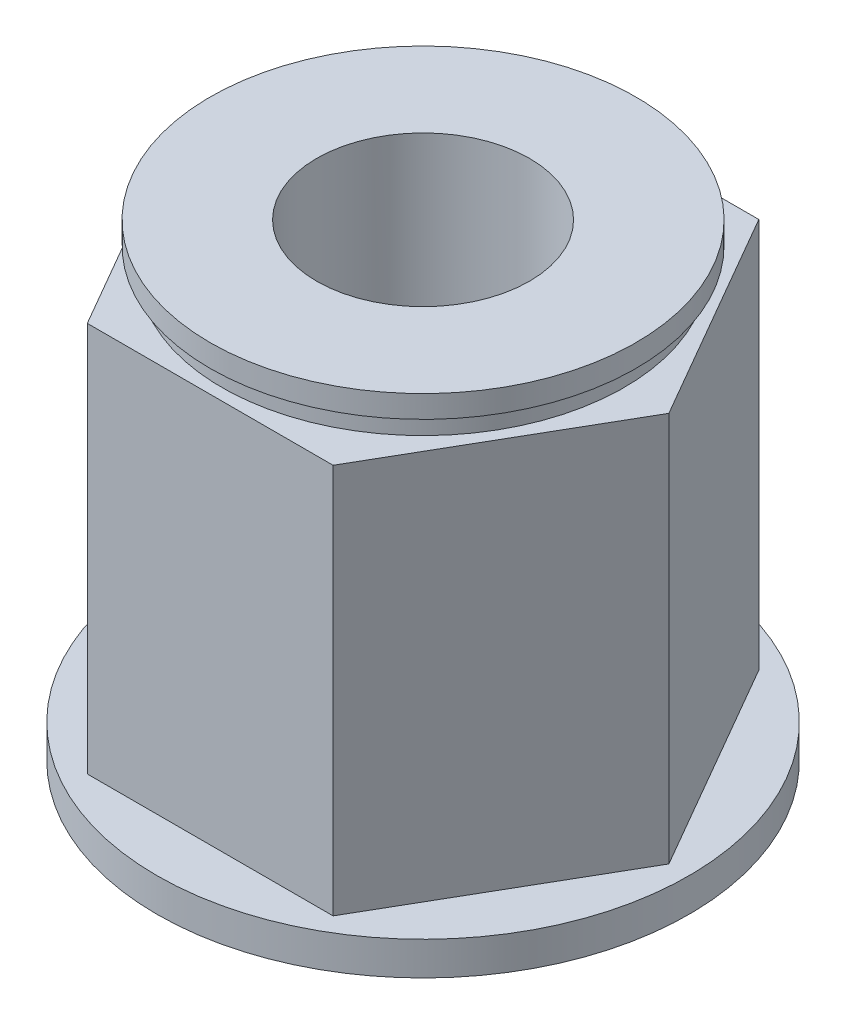
ISO-10303-21;
HEADER;
FILE_DESCRIPTION(('STEP AP214'),'2;1');
FILE_NAME('part.step','',(''),(''),'','','');
FILE_SCHEMA(('AUTOMOTIVE_DESIGN { 1 0 10303 214 1 1 1 1 }'));
ENDSEC;
DATA;
#1=APPLICATION_CONTEXT('core data for automotive mechanical design processes');
#2=APPLICATION_PROTOCOL_DEFINITION('international standard','automotive_design',2000,#1);
#3=PRODUCT_CONTEXT('',#1,'mechanical');
#4=PRODUCT('Part','Part','',(#3));
#5=PRODUCT_RELATED_PRODUCT_CATEGORY('part','',(#4));
#6=PRODUCT_DEFINITION_FORMATION('','',#4);
#7=PRODUCT_DEFINITION_CONTEXT('part definition',#1,'design');
#8=PRODUCT_DEFINITION('design','',#6,#7);
#9=PRODUCT_DEFINITION_SHAPE('','',#8);
#10=(LENGTH_UNIT() NAMED_UNIT(*) SI_UNIT(.MILLI.,.METRE.));
#11=(NAMED_UNIT(*) PLANE_ANGLE_UNIT() SI_UNIT($,.RADIAN.));
#12=(NAMED_UNIT(*) SI_UNIT($,.STERADIAN.) SOLID_ANGLE_UNIT());
#13=UNCERTAINTY_MEASURE_WITH_UNIT(LENGTH_MEASURE(1.E-05),#10,'distance_accuracy_value','');
#14=(GEOMETRIC_REPRESENTATION_CONTEXT(3) GLOBAL_UNCERTAINTY_ASSIGNED_CONTEXT((#13)) GLOBAL_UNIT_ASSIGNED_CONTEXT((#10,
#11,#12)) REPRESENTATION_CONTEXT('',''));
#15=CARTESIAN_POINT('',(0.,0.,0.));
#16=DIRECTION('',(0.,0.,1.));
#17=DIRECTION('',(1.,0.,0.));
#18=AXIS2_PLACEMENT_3D('',#15,#16,#17);
#19=CARTESIAN_POINT('',(0.,0.,0.));
#20=DIRECTION('',(0.,1.,0.));
#21=DIRECTION('',(0.,0.,1.));
#22=AXIS2_PLACEMENT_3D('',#19,#20,#21);
#23=PLANE('',#22);
#24=CARTESIAN_POINT('',(0.,0.,0.));
#25=DIRECTION('',(0.,1.,0.));
#26=DIRECTION('',(0.,0.,1.));
#27=AXIS2_PLACEMENT_3D('',#24,#25,#26);
#28=CIRCLE('',#27,11.90625);
#29=CARTESIAN_POINT('',(0.,0.,11.90625));
#30=VERTEX_POINT('',#29);
#31=EDGE_CURVE('E41',#30,#30,#28,.T.);
#32=ORIENTED_EDGE('',*,*,#31,.T.);
#33=EDGE_LOOP('',(#32));
#34=FACE_BOUND('',#33,.T.);
#35=DIRECTION('',(1.,0.,0.));
#36=VECTOR('',#35,1.);
#37=CARTESIAN_POINT('',(5.49926131403119,0.,9.525));
#38=LINE('',#37,#36);
#39=CARTESIAN_POINT('',(-5.49926131403119,0.,9.525));
#40=VERTEX_POINT('',#39);
#41=CARTESIAN_POINT('',(5.49926131403119,0.,9.525));
#42=VERTEX_POINT('',#41);
#43=EDGE_CURVE('E120',#40,#42,#38,.T.);
#44=ORIENTED_EDGE('',*,*,#43,.F.);
#45=DIRECTION('',(0.5,0.,0.866025403784439));
#46=VECTOR('',#45,1.);
#47=CARTESIAN_POINT('',(-5.49926131403119,0.,9.525));
#48=LINE('',#47,#46);
#49=CARTESIAN_POINT('',(-10.9985226280624,0.,0.));
#50=VERTEX_POINT('',#49);
#51=EDGE_CURVE('E117',#50,#40,#48,.T.);
#52=ORIENTED_EDGE('',*,*,#51,.F.);
#53=DIRECTION('',(-0.5,0.,0.866025403784439));
#54=VECTOR('',#53,1.);
#55=CARTESIAN_POINT('',(-10.9985226280624,0.,0.));
#56=LINE('',#55,#54);
#57=CARTESIAN_POINT('',(-5.49926131403119,0.,-9.525));
#58=VERTEX_POINT('',#57);
#59=EDGE_CURVE('E76',#58,#50,#56,.T.);
#60=ORIENTED_EDGE('',*,*,#59,.F.);
#61=DIRECTION('',(-1.,0.,0.));
#62=VECTOR('',#61,1.);
#63=CARTESIAN_POINT('',(-5.49926131403119,0.,-9.525));
#64=LINE('',#63,#62);
#65=CARTESIAN_POINT('',(5.49926131403118,0.,-9.525));
#66=VERTEX_POINT('',#65);
#67=EDGE_CURVE('E126',#66,#58,#64,.T.);
#68=ORIENTED_EDGE('',*,*,#67,.F.);
#69=DIRECTION('',(-0.5,0.,-0.866025403784439));
#70=VECTOR('',#69,1.);
#71=CARTESIAN_POINT('',(5.49926131403118,0.,-9.525));
#72=LINE('',#71,#70);
#73=CARTESIAN_POINT('',(10.9985226280624,0.,0.));
#74=VERTEX_POINT('',#73);
#75=EDGE_CURVE('E106',#74,#66,#72,.T.);
#76=ORIENTED_EDGE('',*,*,#75,.F.);
#77=DIRECTION('',(0.5,0.,-0.866025403784439));
#78=VECTOR('',#77,1.);
#79=CARTESIAN_POINT('',(10.9985226280624,0.,0.));
#80=LINE('',#79,#78);
#81=EDGE_CURVE('E123',#42,#74,#80,.T.);
#82=ORIENTED_EDGE('',*,*,#81,.F.);
#83=EDGE_LOOP('',(#44,#52,#60,#68,#76,#82));
#84=FACE_BOUND('',#83,.T.);
#85=ADVANCED_FACE('F33',(#34,#84),#23,.T.);
#86=CARTESIAN_POINT('',(0.,-1.5,0.));
#87=DIRECTION('',(0.,1.,0.));
#88=DIRECTION('',(0.,0.,1.));
#89=AXIS2_PLACEMENT_3D('',#86,#87,#88);
#90=CYLINDRICAL_SURFACE('',#89,11.90625);
#91=CARTESIAN_POINT('',(0.,-1.5,0.));
#92=DIRECTION('',(0.,1.,0.));
#93=DIRECTION('',(0.,0.,1.));
#94=AXIS2_PLACEMENT_3D('',#91,#92,#93);
#95=CIRCLE('',#94,11.90625);
#96=CARTESIAN_POINT('',(0.,-1.5,11.90625));
#97=VERTEX_POINT('',#96);
#98=EDGE_CURVE('E11',#97,#97,#95,.T.);
#99=ORIENTED_EDGE('',*,*,#98,.T.);
#100=EDGE_LOOP('',(#99));
#101=FACE_BOUND('',#100,.T.);
#102=ORIENTED_EDGE('',*,*,#31,.F.);
#103=EDGE_LOOP('',(#102));
#104=FACE_BOUND('',#103,.T.);
#105=ADVANCED_FACE('F35',(#101,#104),#90,.T.);
#106=CARTESIAN_POINT('',(11.90625,-1.5,0.));
#107=DIRECTION('',(0.,-1.,0.));
#108=DIRECTION('',(0.,0.,-1.));
#109=AXIS2_PLACEMENT_3D('',#106,#107,#108);
#110=PLANE('',#109);
#111=CARTESIAN_POINT('',(0.,-1.5,0.));
#112=DIRECTION('',(0.,-1.,0.));
#113=DIRECTION('',(0.,0.,-1.));
#114=AXIS2_PLACEMENT_3D('',#111,#112,#113);
#115=CIRCLE('',#114,4.76249999999999);
#116=CARTESIAN_POINT('',(0.,-1.5,-4.76249999999999));
#117=VERTEX_POINT('',#116);
#118=EDGE_CURVE('E204',#117,#117,#115,.T.);
#119=ORIENTED_EDGE('',*,*,#118,.F.);
#120=EDGE_LOOP('',(#119));
#121=FACE_BOUND('',#120,.T.);
#122=ORIENTED_EDGE('',*,*,#98,.F.);
#123=EDGE_LOOP('',(#122));
#124=FACE_BOUND('',#123,.T.);
#125=ADVANCED_FACE('F143',(#121,#124),#110,.T.);
#126=CARTESIAN_POINT('',(-5.49926131403119,17.4625,9.525));
#127=DIRECTION('',(0.866025403784439,0.,-0.5));
#128=DIRECTION('',(-0.5,0.,-0.866025403784439));
#129=AXIS2_PLACEMENT_3D('',#126,#127,#128);
#130=PLANE('',#129);
#131=ORIENTED_EDGE('',*,*,#51,.T.);
#132=DIRECTION('',(0.,-1.,0.));
#133=VECTOR('',#132,1.);
#134=CARTESIAN_POINT('',(-5.49926131403119,17.4625,9.525));
#135=LINE('',#134,#133);
#136=CARTESIAN_POINT('',(-5.49926131403119,17.4625,9.525));
#137=VERTEX_POINT('',#136);
#138=EDGE_CURVE('E136',#137,#40,#135,.T.);
#139=ORIENTED_EDGE('',*,*,#138,.F.);
#140=DIRECTION('',(0.5,0.,0.866025403784439));
#141=VECTOR('',#140,1.);
#142=CARTESIAN_POINT('',(-5.49926131403119,17.4625,9.525));
#143=LINE('',#142,#141);
#144=CARTESIAN_POINT('',(-10.9985226280624,17.4625,0.));
#145=VERTEX_POINT('',#144);
#146=EDGE_CURVE('E129',#145,#137,#143,.T.);
#147=ORIENTED_EDGE('',*,*,#146,.F.);
#148=DIRECTION('',(0.,-1.,0.));
#149=VECTOR('',#148,1.);
#150=CARTESIAN_POINT('',(-10.9985226280624,17.4625,0.));
#151=LINE('',#150,#149);
#152=EDGE_CURVE('E113',#145,#50,#151,.T.);
#153=ORIENTED_EDGE('',*,*,#152,.T.);
#154=EDGE_LOOP('',(#131,#139,#147,#153));
#155=FACE_BOUND('',#154,.T.);
#156=ADVANCED_FACE('F149',(#155),#130,.F.);
#157=CARTESIAN_POINT('',(5.49926131403119,17.4625,9.525));
#158=DIRECTION('',(0.,0.,-1.));
#159=DIRECTION('',(-1.,0.,0.));
#160=AXIS2_PLACEMENT_3D('',#157,#158,#159);
#161=PLANE('',#160);
#162=ORIENTED_EDGE('',*,*,#43,.T.);
#163=DIRECTION('',(0.,-1.,0.));
#164=VECTOR('',#163,1.);
#165=CARTESIAN_POINT('',(5.49926131403119,17.4625,9.525));
#166=LINE('',#165,#164);
#167=CARTESIAN_POINT('',(5.49926131403119,17.4625,9.525));
#168=VERTEX_POINT('',#167);
#169=EDGE_CURVE('E133',#168,#42,#166,.T.);
#170=ORIENTED_EDGE('',*,*,#169,.F.);
#171=DIRECTION('',(1.,0.,0.));
#172=VECTOR('',#171,1.);
#173=CARTESIAN_POINT('',(5.49926131403119,17.4625,9.525));
#174=LINE('',#173,#172);
#175=EDGE_CURVE('E84',#137,#168,#174,.T.);
#176=ORIENTED_EDGE('',*,*,#175,.F.);
#177=ORIENTED_EDGE('',*,*,#138,.T.);
#178=EDGE_LOOP('',(#162,#170,#176,#177));
#179=FACE_BOUND('',#178,.T.);
#180=ADVANCED_FACE('F159',(#179),#161,.F.);
#181=CARTESIAN_POINT('',(10.9985226280624,17.4625,0.));
#182=DIRECTION('',(-0.866025403784439,0.,-0.5));
#183=DIRECTION('',(-0.5,0.,0.866025403784439));
#184=AXIS2_PLACEMENT_3D('',#181,#182,#183);
#185=PLANE('',#184);
#186=ORIENTED_EDGE('',*,*,#81,.T.);
#187=DIRECTION('',(0.,-1.,0.));
#188=VECTOR('',#187,1.);
#189=CARTESIAN_POINT('',(10.9985226280624,17.4625,0.));
#190=LINE('',#189,#188);
#191=CARTESIAN_POINT('',(10.9985226280624,17.4625,0.));
#192=VERTEX_POINT('',#191);
#193=EDGE_CURVE('E109',#192,#74,#190,.T.);
#194=ORIENTED_EDGE('',*,*,#193,.F.);
#195=DIRECTION('',(0.5,0.,-0.866025403784439));
#196=VECTOR('',#195,1.);
#197=CARTESIAN_POINT('',(10.9985226280624,17.4625,0.));
#198=LINE('',#197,#196);
#199=EDGE_CURVE('E97',#168,#192,#198,.T.);
#200=ORIENTED_EDGE('',*,*,#199,.F.);
#201=ORIENTED_EDGE('',*,*,#169,.T.);
#202=EDGE_LOOP('',(#186,#194,#200,#201));
#203=FACE_BOUND('',#202,.T.);
#204=ADVANCED_FACE('F163',(#203),#185,.F.);
#205=CARTESIAN_POINT('',(5.49926131403118,17.4625,-9.525));
#206=DIRECTION('',(-0.866025403784439,0.,0.5));
#207=DIRECTION('',(0.5,0.,0.866025403784439));
#208=AXIS2_PLACEMENT_3D('',#205,#206,#207);
#209=PLANE('',#208);
#210=ORIENTED_EDGE('',*,*,#75,.T.);
#211=DIRECTION('',(0.,-1.,0.));
#212=VECTOR('',#211,1.);
#213=CARTESIAN_POINT('',(5.49926131403118,17.4625,-9.525));
#214=LINE('',#213,#212);
#215=CARTESIAN_POINT('',(5.49926131403118,17.4625,-9.525));
#216=VERTEX_POINT('',#215);
#217=EDGE_CURVE('E103',#216,#66,#214,.T.);
#218=ORIENTED_EDGE('',*,*,#217,.F.);
#219=DIRECTION('',(-0.5,0.,-0.866025403784439));
#220=VECTOR('',#219,1.);
#221=CARTESIAN_POINT('',(5.49926131403118,17.4625,-9.525));
#222=LINE('',#221,#220);
#223=EDGE_CURVE('E91',#192,#216,#222,.T.);
#224=ORIENTED_EDGE('',*,*,#223,.F.);
#225=ORIENTED_EDGE('',*,*,#193,.T.);
#226=EDGE_LOOP('',(#210,#218,#224,#225));
#227=FACE_BOUND('',#226,.T.);
#228=ADVANCED_FACE('F104',(#227),#209,.F.);
#229=CARTESIAN_POINT('',(-5.49926131403119,17.4625,-9.525));
#230=DIRECTION('',(0.,0.,1.));
#231=DIRECTION('',(1.,0.,0.));
#232=AXIS2_PLACEMENT_3D('',#229,#230,#231);
#233=PLANE('',#232);
#234=ORIENTED_EDGE('',*,*,#67,.T.);
#235=DIRECTION('',(0.,-1.,0.));
#236=VECTOR('',#235,1.);
#237=CARTESIAN_POINT('',(-5.49926131403119,17.4625,-9.525));
#238=LINE('',#237,#236);
#239=CARTESIAN_POINT('',(-5.49926131403119,17.4625,-9.525));
#240=VERTEX_POINT('',#239);
#241=EDGE_CURVE('E48',#240,#58,#238,.T.);
#242=ORIENTED_EDGE('',*,*,#241,.F.);
#243=DIRECTION('',(-1.,0.,0.));
#244=VECTOR('',#243,1.);
#245=CARTESIAN_POINT('',(-5.49926131403119,17.4625,-9.525));
#246=LINE('',#245,#244);
#247=EDGE_CURVE('E95',#216,#240,#246,.T.);
#248=ORIENTED_EDGE('',*,*,#247,.F.);
#249=ORIENTED_EDGE('',*,*,#217,.T.);
#250=EDGE_LOOP('',(#234,#242,#248,#249));
#251=FACE_BOUND('',#250,.T.);
#252=ADVANCED_FACE('F111',(#251),#233,.F.);
#253=CARTESIAN_POINT('',(-10.9985226280624,17.4625,0.));
#254=DIRECTION('',(0.866025403784439,0.,0.5));
#255=DIRECTION('',(0.5,0.,-0.866025403784439));
#256=AXIS2_PLACEMENT_3D('',#253,#254,#255);
#257=PLANE('',#256);
#258=ORIENTED_EDGE('',*,*,#59,.T.);
#259=ORIENTED_EDGE('',*,*,#152,.F.);
#260=DIRECTION('',(-0.5,0.,0.866025403784439));
#261=VECTOR('',#260,1.);
#262=CARTESIAN_POINT('',(-10.9985226280624,17.4625,0.));
#263=LINE('',#262,#261);
#264=EDGE_CURVE('E56',#240,#145,#263,.T.);
#265=ORIENTED_EDGE('',*,*,#264,.F.);
#266=ORIENTED_EDGE('',*,*,#241,.T.);
#267=EDGE_LOOP('',(#258,#259,#265,#266));
#268=FACE_BOUND('',#267,.T.);
#269=ADVANCED_FACE('F171',(#268),#257,.F.);
#270=CARTESIAN_POINT('',(0.,17.4625,0.));
#271=DIRECTION('',(0.,-1.,0.));
#272=DIRECTION('',(0.,0.,-1.));
#273=AXIS2_PLACEMENT_3D('',#270,#271,#272);
#274=PLANE('',#273);
#275=CARTESIAN_POINT('',(0.,17.4625,0.));
#276=DIRECTION('',(0.,-1.,0.));
#277=DIRECTION('',(0.,0.,-1.));
#278=AXIS2_PLACEMENT_3D('',#275,#276,#277);
#279=CIRCLE('',#278,9.);
#280=CARTESIAN_POINT('',(0.,17.4625,-9.));
#281=VERTEX_POINT('',#280);
#282=EDGE_CURVE('E121',#281,#281,#279,.T.);
#283=ORIENTED_EDGE('',*,*,#282,.T.);
#284=EDGE_LOOP('',(#283));
#285=FACE_BOUND('',#284,.T.);
#286=ORIENTED_EDGE('',*,*,#146,.T.);
#287=ORIENTED_EDGE('',*,*,#175,.T.);
#288=ORIENTED_EDGE('',*,*,#199,.T.);
#289=ORIENTED_EDGE('',*,*,#223,.T.);
#290=ORIENTED_EDGE('',*,*,#247,.T.);
#291=ORIENTED_EDGE('',*,*,#264,.T.);
#292=EDGE_LOOP('',(#286,#287,#288,#289,#290,#291));
#293=FACE_BOUND('',#292,.T.);
#294=ADVANCED_FACE('F93',(#285,#293),#274,.F.);
#295=CARTESIAN_POINT('',(0.,18.4625,0.));
#296=DIRECTION('',(0.,-1.,0.));
#297=DIRECTION('',(0.,0.,-1.));
#298=AXIS2_PLACEMENT_3D('',#295,#296,#297);
#299=CYLINDRICAL_SURFACE('',#298,9.);
#300=CARTESIAN_POINT('',(0.,18.4625,0.));
#301=DIRECTION('',(0.,1.,0.));
#302=DIRECTION('',(0.,0.,1.));
#303=AXIS2_PLACEMENT_3D('',#300,#301,#302);
#304=CIRCLE('',#303,9.);
#305=CARTESIAN_POINT('',(0.,18.4625,9.));
#306=VERTEX_POINT('',#305);
#307=EDGE_CURVE('E212',#306,#306,#304,.F.);
#308=ORIENTED_EDGE('',*,*,#307,.T.);
#309=EDGE_LOOP('',(#308));
#310=FACE_BOUND('',#309,.T.);
#311=ORIENTED_EDGE('',*,*,#282,.F.);
#312=EDGE_LOOP('',(#311));
#313=FACE_BOUND('',#312,.T.);
#314=ADVANCED_FACE('F176',(#310,#313),#299,.T.);
#315=CARTESIAN_POINT('',(0.,19.4625,0.));
#316=DIRECTION('',(0.,-1.,0.));
#317=DIRECTION('',(0.,0.,-1.));
#318=AXIS2_PLACEMENT_3D('',#315,#316,#317);
#319=CYLINDRICAL_SURFACE('',#318,9.525);
#320=CARTESIAN_POINT('',(0.,19.4625,0.));
#321=DIRECTION('',(0.,1.,0.));
#322=DIRECTION('',(0.,0.,1.));
#323=AXIS2_PLACEMENT_3D('',#320,#321,#322);
#324=CIRCLE('',#323,9.525);
#325=CARTESIAN_POINT('',(0.,19.4625,9.525));
#326=VERTEX_POINT('',#325);
#327=EDGE_CURVE('E209',#326,#326,#324,.T.);
#328=ORIENTED_EDGE('',*,*,#327,.F.);
#329=EDGE_LOOP('',(#328));
#330=FACE_BOUND('',#329,.T.);
#331=CARTESIAN_POINT('',(0.,18.4625,0.));
#332=DIRECTION('',(0.,1.,0.));
#333=DIRECTION('',(0.,0.,1.));
#334=AXIS2_PLACEMENT_3D('',#331,#332,#333);
#335=CIRCLE('',#334,9.525);
#336=CARTESIAN_POINT('',(0.,18.4625,9.525));
#337=VERTEX_POINT('',#336);
#338=EDGE_CURVE('E206',#337,#337,#335,.T.);
#339=ORIENTED_EDGE('',*,*,#338,.T.);
#340=EDGE_LOOP('',(#339));
#341=FACE_BOUND('',#340,.T.);
#342=ADVANCED_FACE('F180',(#330,#341),#319,.T.);
#343=CARTESIAN_POINT('',(0.,19.4625,0.));
#344=DIRECTION('',(0.,1.,0.));
#345=DIRECTION('',(0.,0.,1.));
#346=AXIS2_PLACEMENT_3D('',#343,#344,#345);
#347=PLANE('',#346);
#348=CARTESIAN_POINT('',(0.,19.4625,0.));
#349=DIRECTION('',(0.,1.,0.));
#350=DIRECTION('',(0.,0.,1.));
#351=AXIS2_PLACEMENT_3D('',#348,#349,#350);
#352=CIRCLE('',#351,4.76249999999999);
#353=CARTESIAN_POINT('',(0.,19.4625,4.76249999999999));
#354=VERTEX_POINT('',#353);
#355=EDGE_CURVE('E201',#354,#354,#352,.F.);
#356=ORIENTED_EDGE('',*,*,#355,.T.);
#357=EDGE_LOOP('',(#356));
#358=FACE_BOUND('',#357,.T.);
#359=ORIENTED_EDGE('',*,*,#327,.T.);
#360=EDGE_LOOP('',(#359));
#361=FACE_BOUND('',#360,.T.);
#362=ADVANCED_FACE('F184',(#358,#361),#347,.T.);
#363=CARTESIAN_POINT('',(0.,18.4625,0.));
#364=DIRECTION('',(0.,1.,0.));
#365=DIRECTION('',(0.,0.,1.));
#366=AXIS2_PLACEMENT_3D('',#363,#364,#365);
#367=PLANE('',#366);
#368=ORIENTED_EDGE('',*,*,#307,.F.);
#369=EDGE_LOOP('',(#368));
#370=FACE_BOUND('',#369,.T.);
#371=ORIENTED_EDGE('',*,*,#338,.F.);
#372=EDGE_LOOP('',(#371));
#373=FACE_BOUND('',#372,.T.);
#374=ADVANCED_FACE('F186',(#370,#373),#367,.F.);
#375=CARTESIAN_POINT('',(0.,-1.5,0.));
#376=DIRECTION('',(0.,-1.,0.));
#377=DIRECTION('',(0.,0.,-1.));
#378=AXIS2_PLACEMENT_3D('',#375,#376,#377);
#379=CYLINDRICAL_SURFACE('',#378,4.76249999999999);
#380=ORIENTED_EDGE('',*,*,#355,.F.);
#381=EDGE_LOOP('',(#380));
#382=FACE_BOUND('',#381,.T.);
#383=ORIENTED_EDGE('',*,*,#118,.T.);
#384=EDGE_LOOP('',(#383));
#385=FACE_BOUND('',#384,.T.);
#386=ADVANCED_FACE('F189',(#382,#385),#379,.F.);
#387=CLOSED_SHELL('',(#85,#105,#125,#156,#180,#204,#228,#252,#269,#294,#314,#342,#362,#374,#386));
#388=MANIFOLD_SOLID_BREP('B2',#387);
#389=ADVANCED_BREP_SHAPE_REPRESENTATION('',(#18,#388),#14);
#390=SHAPE_DEFINITION_REPRESENTATION(#9,#389);
ENDSEC;
END-ISO-10303-21;
